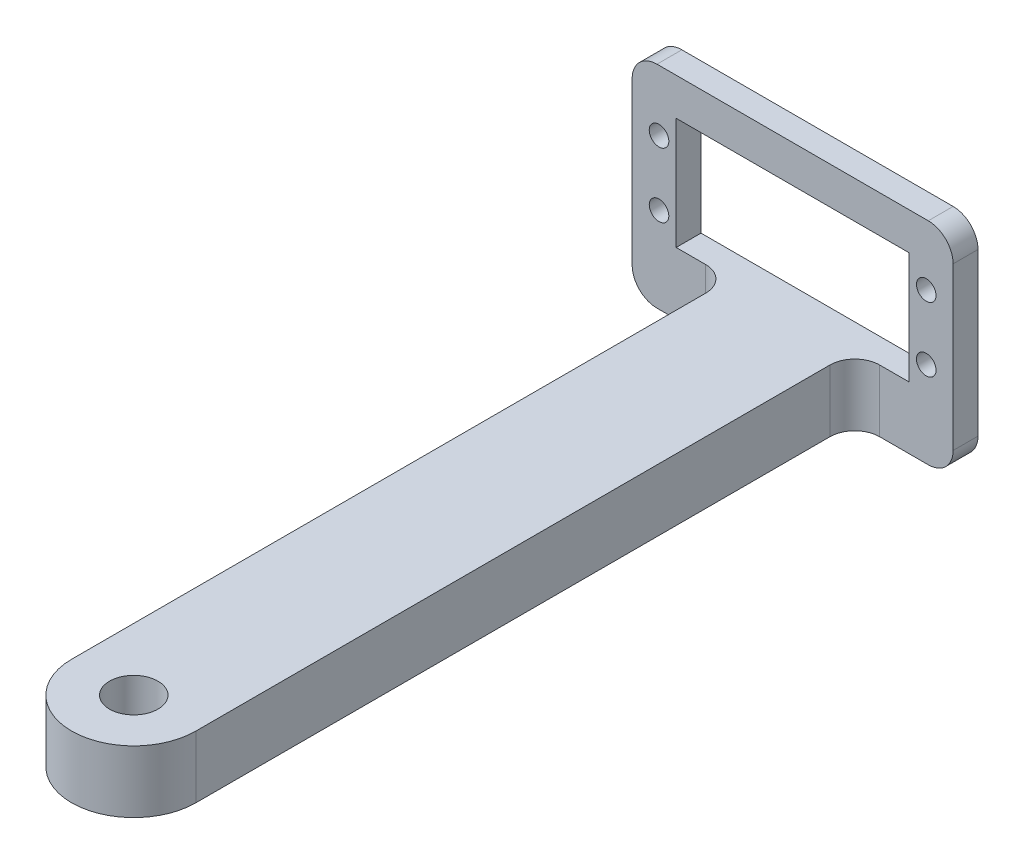
ISO-10303-21;
HEADER;
FILE_DESCRIPTION(('STEP AP214'),'2;1');
FILE_NAME('part.step','',(''),(''),'','','');
FILE_SCHEMA(('AUTOMOTIVE_DESIGN { 1 0 10303 214 1 1 1 1 }'));
ENDSEC;
DATA;
#1=APPLICATION_CONTEXT('core data for automotive mechanical design processes');
#2=APPLICATION_PROTOCOL_DEFINITION('international standard','automotive_design',2000,#1);
#3=PRODUCT_CONTEXT('',#1,'mechanical');
#4=PRODUCT('Part','Part','',(#3));
#5=PRODUCT_RELATED_PRODUCT_CATEGORY('part','',(#4));
#6=PRODUCT_DEFINITION_FORMATION('','',#4);
#7=PRODUCT_DEFINITION_CONTEXT('part definition',#1,'design');
#8=PRODUCT_DEFINITION('design','',#6,#7);
#9=PRODUCT_DEFINITION_SHAPE('','',#8);
#10=(LENGTH_UNIT() NAMED_UNIT(*) SI_UNIT(.MILLI.,.METRE.));
#11=(NAMED_UNIT(*) PLANE_ANGLE_UNIT() SI_UNIT($,.RADIAN.));
#12=(NAMED_UNIT(*) SI_UNIT($,.STERADIAN.) SOLID_ANGLE_UNIT());
#13=UNCERTAINTY_MEASURE_WITH_UNIT(LENGTH_MEASURE(1.E-05),#10,'distance_accuracy_value','');
#14=(GEOMETRIC_REPRESENTATION_CONTEXT(3) GLOBAL_UNCERTAINTY_ASSIGNED_CONTEXT((#13)) GLOBAL_UNIT_ASSIGNED_CONTEXT((#10,
#11,#12)) REPRESENTATION_CONTEXT('',''));
#15=CARTESIAN_POINT('',(0.,0.,0.));
#16=DIRECTION('',(0.,0.,1.));
#17=DIRECTION('',(1.,0.,0.));
#18=AXIS2_PLACEMENT_3D('',#15,#16,#17);
#19=CARTESIAN_POINT('',(-6.35,3.175,38.1));
#20=DIRECTION('',(1.,0.,0.));
#21=DIRECTION('',(0.,0.,-1.));
#22=AXIS2_PLACEMENT_3D('',#19,#20,#21);
#23=PLANE('',#22);
#24=DIRECTION('',(0.,0.,-1.));
#25=VECTOR('',#24,1.);
#26=CARTESIAN_POINT('',(-6.35,3.175,38.1));
#27=LINE('',#26,#25);
#28=CARTESIAN_POINT('',(-6.35,3.175,31.75));
#29=VERTEX_POINT('',#28);
#30=CARTESIAN_POINT('',(-6.35,3.175,-33.02));
#31=VERTEX_POINT('',#30);
#32=EDGE_CURVE('E241',#29,#31,#27,.T.);
#33=ORIENTED_EDGE('',*,*,#32,.T.);
#34=DIRECTION('',(0.,1.,0.));
#35=VECTOR('',#34,1.);
#36=CARTESIAN_POINT('',(-6.35,-3.175,-33.02));
#37=LINE('',#36,#35);
#38=CARTESIAN_POINT('',(-6.35,-3.175,-33.02));
#39=VERTEX_POINT('',#38);
#40=EDGE_CURVE('E303',#31,#39,#37,.F.);
#41=ORIENTED_EDGE('',*,*,#40,.T.);
#42=DIRECTION('',(0.,0.,-1.));
#43=VECTOR('',#42,1.);
#44=CARTESIAN_POINT('',(-6.35,-3.175,38.1));
#45=LINE('',#44,#43);
#46=CARTESIAN_POINT('',(-6.35,-3.175,31.75));
#47=VERTEX_POINT('',#46);
#48=EDGE_CURVE('E247',#47,#39,#45,.T.);
#49=ORIENTED_EDGE('',*,*,#48,.F.);
#50=DIRECTION('',(0.,1.,0.));
#51=VECTOR('',#50,1.);
#52=CARTESIAN_POINT('',(-6.35,-3.175,31.75));
#53=LINE('',#52,#51);
#54=EDGE_CURVE('E250',#47,#29,#53,.T.);
#55=ORIENTED_EDGE('',*,*,#54,.T.);
#56=EDGE_LOOP('',(#33,#41,#49,#55));
#57=FACE_BOUND('',#56,.T.);
#58=ADVANCED_FACE('F35',(#57),#23,.F.);
#59=CARTESIAN_POINT('',(6.35,3.175,38.1));
#60=DIRECTION('',(-1.,0.,0.));
#61=DIRECTION('',(0.,0.,1.));
#62=AXIS2_PLACEMENT_3D('',#59,#60,#61);
#63=PLANE('',#62);
#64=DIRECTION('',(0.,0.,-1.));
#65=VECTOR('',#64,1.);
#66=CARTESIAN_POINT('',(6.35,-3.175,38.1));
#67=LINE('',#66,#65);
#68=CARTESIAN_POINT('',(6.35,-3.175,31.75));
#69=VERTEX_POINT('',#68);
#70=CARTESIAN_POINT('',(6.35,-3.175,-33.02));
#71=VERTEX_POINT('',#70);
#72=EDGE_CURVE('E245',#69,#71,#67,.T.);
#73=ORIENTED_EDGE('',*,*,#72,.T.);
#74=DIRECTION('',(0.,-1.,0.));
#75=VECTOR('',#74,1.);
#76=CARTESIAN_POINT('',(6.35,3.175,-33.02));
#77=LINE('',#76,#75);
#78=CARTESIAN_POINT('',(6.35,3.175,-33.02));
#79=VERTEX_POINT('',#78);
#80=EDGE_CURVE('E57',#71,#79,#77,.F.);
#81=ORIENTED_EDGE('',*,*,#80,.T.);
#82=DIRECTION('',(0.,0.,-1.));
#83=VECTOR('',#82,1.);
#84=CARTESIAN_POINT('',(6.35,3.175,38.1));
#85=LINE('',#84,#83);
#86=CARTESIAN_POINT('',(6.35,3.175,31.75));
#87=VERTEX_POINT('',#86);
#88=EDGE_CURVE('E243',#87,#79,#85,.T.);
#89=ORIENTED_EDGE('',*,*,#88,.F.);
#90=DIRECTION('',(0.,1.,0.));
#91=VECTOR('',#90,1.);
#92=CARTESIAN_POINT('',(6.35,-3.175,31.75));
#93=LINE('',#92,#91);
#94=EDGE_CURVE('E253',#87,#69,#93,.F.);
#95=ORIENTED_EDGE('',*,*,#94,.T.);
#96=EDGE_LOOP('',(#73,#81,#89,#95));
#97=FACE_BOUND('',#96,.T.);
#98=ADVANCED_FACE('F320',(#97),#63,.F.);
#99=CARTESIAN_POINT('',(0.,-3.175,31.75));
#100=DIRECTION('',(0.,-1.,0.));
#101=DIRECTION('',(0.,0.,-1.));
#102=AXIS2_PLACEMENT_3D('',#99,#100,#101);
#103=CYLINDRICAL_SURFACE('',#102,6.35);
#104=ORIENTED_EDGE('',*,*,#54,.F.);
#105=CARTESIAN_POINT('',(0.,-3.175,31.75));
#106=DIRECTION('',(0.,1.,0.));
#107=DIRECTION('',(-1.,0.,0.));
#108=AXIS2_PLACEMENT_3D('',#105,#106,#107);
#109=CIRCLE('',#108,6.35);
#110=EDGE_CURVE('E256',#69,#47,#109,.F.);
#111=ORIENTED_EDGE('',*,*,#110,.F.);
#112=ORIENTED_EDGE('',*,*,#94,.F.);
#113=CARTESIAN_POINT('',(0.,3.175,31.75));
#114=DIRECTION('',(0.,-1.,0.));
#115=DIRECTION('',(0.,0.,-1.));
#116=AXIS2_PLACEMENT_3D('',#113,#114,#115);
#117=CIRCLE('',#116,6.35);
#118=EDGE_CURVE('E258',#29,#87,#117,.F.);
#119=ORIENTED_EDGE('',*,*,#118,.F.);
#120=EDGE_LOOP('',(#104,#111,#112,#119));
#121=FACE_BOUND('',#120,.T.);
#122=ADVANCED_FACE('F324',(#121),#103,.T.);
#123=CARTESIAN_POINT('',(-6.35,-3.175,38.1));
#124=DIRECTION('',(0.,1.,0.));
#125=DIRECTION('',(-1.,0.,0.));
#126=AXIS2_PLACEMENT_3D('',#123,#124,#125);
#127=PLANE('',#126);
#128=DIRECTION('',(-1.,0.,0.));
#129=VECTOR('',#128,1.);
#130=CARTESIAN_POINT('',(16.3957,-3.175,-35.56));
#131=LINE('',#130,#129);
#132=CARTESIAN_POINT('',(-8.89,-3.175,-35.56));
#133=VERTEX_POINT('',#132);
#134=CARTESIAN_POINT('',(-13.8557,-3.175,-35.56));
#135=VERTEX_POINT('',#134);
#136=EDGE_CURVE('E212',#133,#135,#131,.T.);
#137=ORIENTED_EDGE('',*,*,#136,.T.);
#138=DIRECTION('',(0.,0.,-1.));
#139=VECTOR('',#138,1.);
#140=CARTESIAN_POINT('',(-13.8557,-3.175,-38.1));
#141=LINE('',#140,#139);
#142=CARTESIAN_POINT('',(-13.8557,-3.175,-38.1));
#143=VERTEX_POINT('',#142);
#144=EDGE_CURVE('E262',#135,#143,#141,.T.);
#145=ORIENTED_EDGE('',*,*,#144,.T.);
#146=DIRECTION('',(1.,0.,0.));
#147=VECTOR('',#146,1.);
#148=CARTESIAN_POINT('',(-6.35,-3.175,-38.1));
#149=LINE('',#148,#147);
#150=CARTESIAN_POINT('',(13.8557,-3.175,-38.1));
#151=VERTEX_POINT('',#150);
#152=EDGE_CURVE('E236',#143,#151,#149,.T.);
#153=ORIENTED_EDGE('',*,*,#152,.T.);
#154=DIRECTION('',(0.,0.,-1.));
#155=VECTOR('',#154,1.);
#156=CARTESIAN_POINT('',(13.8557,-3.175,-35.56));
#157=LINE('',#156,#155);
#158=CARTESIAN_POINT('',(13.8557,-3.175,-35.56));
#159=VERTEX_POINT('',#158);
#160=EDGE_CURVE('E260',#151,#159,#157,.F.);
#161=ORIENTED_EDGE('',*,*,#160,.T.);
#162=CARTESIAN_POINT('',(8.89,-3.175,-35.56));
#163=VERTEX_POINT('',#162);
#164=EDGE_CURVE('E216',#159,#163,#131,.T.);
#165=ORIENTED_EDGE('',*,*,#164,.T.);
#166=CARTESIAN_POINT('',(8.89,-3.175,-33.02));
#167=DIRECTION('',(0.,1.,0.));
#168=DIRECTION('',(-1.,0.,0.));
#169=AXIS2_PLACEMENT_3D('',#166,#167,#168);
#170=CIRCLE('',#169,2.54);
#171=EDGE_CURVE('E305',#163,#71,#170,.T.);
#172=ORIENTED_EDGE('',*,*,#171,.T.);
#173=ORIENTED_EDGE('',*,*,#72,.F.);
#174=ORIENTED_EDGE('',*,*,#110,.T.);
#175=ORIENTED_EDGE('',*,*,#48,.T.);
#176=CARTESIAN_POINT('',(-8.89,-3.175,-33.02));
#177=DIRECTION('',(0.,1.,0.));
#178=DIRECTION('',(-1.,0.,0.));
#179=AXIS2_PLACEMENT_3D('',#176,#177,#178);
#180=CIRCLE('',#179,2.54);
#181=EDGE_CURVE('E11',#39,#133,#180,.T.);
#182=ORIENTED_EDGE('',*,*,#181,.T.);
#183=EDGE_LOOP('',(#137,#145,#153,#161,#165,#172,#173,#174,#175,#182));
#184=FACE_BOUND('',#183,.T.);
#185=CARTESIAN_POINT('',(0.,-3.175,31.75));
#186=DIRECTION('',(0.,1.,0.));
#187=DIRECTION('',(-1.,0.,0.));
#188=AXIS2_PLACEMENT_3D('',#185,#186,#187);
#189=CIRCLE('',#188,2.4765);
#190=CARTESIAN_POINT('',(-2.4765,-3.175,31.75));
#191=VERTEX_POINT('',#190);
#192=EDGE_CURVE('E233',#191,#191,#189,.F.);
#193=ORIENTED_EDGE('',*,*,#192,.F.);
#194=EDGE_LOOP('',(#193));
#195=FACE_BOUND('',#194,.T.);
#196=ADVANCED_FACE('F318',(#184,#195),#127,.F.);
#197=CARTESIAN_POINT('',(-6.35,3.175,38.1));
#198=DIRECTION('',(0.,-1.,0.));
#199=DIRECTION('',(0.,0.,-1.));
#200=AXIS2_PLACEMENT_3D('',#197,#198,#199);
#201=PLANE('',#200);
#202=DIRECTION('',(-1.,0.,0.));
#203=VECTOR('',#202,1.);
#204=CARTESIAN_POINT('',(-6.35,3.175,-38.1));
#205=LINE('',#204,#203);
#206=CARTESIAN_POINT('',(11.8999,3.175,-38.1));
#207=VERTEX_POINT('',#206);
#208=CARTESIAN_POINT('',(-11.8999,3.175,-38.1));
#209=VERTEX_POINT('',#208);
#210=EDGE_CURVE('E239',#207,#209,#205,.T.);
#211=ORIENTED_EDGE('',*,*,#210,.T.);
#212=DIRECTION('',(0.,0.,-1.));
#213=VECTOR('',#212,1.);
#214=CARTESIAN_POINT('',(-11.8999,3.175,-35.56));
#215=LINE('',#214,#213);
#216=CARTESIAN_POINT('',(-11.8999,3.175,-35.56));
#217=VERTEX_POINT('',#216);
#218=EDGE_CURVE('E205',#217,#209,#215,.T.);
#219=ORIENTED_EDGE('',*,*,#218,.F.);
#220=DIRECTION('',(-1.,0.,0.));
#221=VECTOR('',#220,1.);
#222=CARTESIAN_POINT('',(-11.8999,3.175,-35.56));
#223=LINE('',#222,#221);
#224=CARTESIAN_POINT('',(-8.89,3.175,-35.56));
#225=VERTEX_POINT('',#224);
#226=EDGE_CURVE('E182',#225,#217,#223,.T.);
#227=ORIENTED_EDGE('',*,*,#226,.F.);
#228=CARTESIAN_POINT('',(-8.89,3.175,-33.02));
#229=DIRECTION('',(0.,-1.,0.));
#230=DIRECTION('',(0.,0.,-1.));
#231=AXIS2_PLACEMENT_3D('',#228,#229,#230);
#232=CIRCLE('',#231,2.54);
#233=EDGE_CURVE('E43',#225,#31,#232,.T.);
#234=ORIENTED_EDGE('',*,*,#233,.T.);
#235=ORIENTED_EDGE('',*,*,#32,.F.);
#236=ORIENTED_EDGE('',*,*,#118,.T.);
#237=ORIENTED_EDGE('',*,*,#88,.T.);
#238=CARTESIAN_POINT('',(8.89,3.175,-33.02));
#239=DIRECTION('',(0.,-1.,0.));
#240=DIRECTION('',(0.,0.,-1.));
#241=AXIS2_PLACEMENT_3D('',#238,#239,#240);
#242=CIRCLE('',#241,2.54);
#243=CARTESIAN_POINT('',(8.89,3.175,-35.56));
#244=VERTEX_POINT('',#243);
#245=EDGE_CURVE('E307',#79,#244,#242,.T.);
#246=ORIENTED_EDGE('',*,*,#245,.T.);
#247=CARTESIAN_POINT('',(11.8999,3.175,-35.56));
#248=VERTEX_POINT('',#247);
#249=EDGE_CURVE('E196',#248,#244,#223,.T.);
#250=ORIENTED_EDGE('',*,*,#249,.F.);
#251=DIRECTION('',(0.,0.,-1.));
#252=VECTOR('',#251,1.);
#253=CARTESIAN_POINT('',(11.8999,3.175,-35.56));
#254=LINE('',#253,#252);
#255=EDGE_CURVE('E172',#248,#207,#254,.T.);
#256=ORIENTED_EDGE('',*,*,#255,.T.);
#257=EDGE_LOOP('',(#211,#219,#227,#234,#235,#236,#237,#246,#250,#256));
#258=FACE_BOUND('',#257,.T.);
#259=CARTESIAN_POINT('',(0.,3.175,31.75));
#260=DIRECTION('',(0.,1.,0.));
#261=DIRECTION('',(0.,0.,1.));
#262=AXIS2_PLACEMENT_3D('',#259,#260,#261);
#263=CIRCLE('',#262,2.4765);
#264=CARTESIAN_POINT('',(0.,3.175,34.2265));
#265=VERTEX_POINT('',#264);
#266=EDGE_CURVE('E223',#265,#265,#263,.T.);
#267=ORIENTED_EDGE('',*,*,#266,.F.);
#268=EDGE_LOOP('',(#267));
#269=FACE_BOUND('',#268,.T.);
#270=ADVANCED_FACE('F309',(#258,#269),#201,.F.);
#271=CARTESIAN_POINT('',(0.,0.,-38.1));
#272=DIRECTION('',(0.,0.,1.));
#273=DIRECTION('',(1.,0.,0.));
#274=AXIS2_PLACEMENT_3D('',#271,#272,#273);
#275=PLANE('',#274);
#276=ORIENTED_EDGE('',*,*,#152,.F.);
#277=CARTESIAN_POINT('',(-13.8557,-0.635000000000002,-38.1));
#278=DIRECTION('',(0.,0.,1.));
#279=DIRECTION('',(1.,0.,0.));
#280=AXIS2_PLACEMENT_3D('',#277,#278,#279);
#281=CIRCLE('',#280,2.54);
#282=CARTESIAN_POINT('',(-16.3957,-0.635,-38.1));
#283=VERTEX_POINT('',#282);
#284=EDGE_CURVE('E271',#143,#283,#281,.F.);
#285=ORIENTED_EDGE('',*,*,#284,.T.);
#286=DIRECTION('',(0.,1.,0.));
#287=VECTOR('',#286,1.);
#288=CARTESIAN_POINT('',(-16.3957,18.415,-38.1));
#289=LINE('',#288,#287);
#290=CARTESIAN_POINT('',(-16.3957,15.875,-38.1));
#291=VERTEX_POINT('',#290);
#292=EDGE_CURVE('E226',#283,#291,#289,.T.);
#293=ORIENTED_EDGE('',*,*,#292,.T.);
#294=CARTESIAN_POINT('',(-13.8557,15.875,-38.1));
#295=DIRECTION('',(0.,0.,1.));
#296=DIRECTION('',(1.,0.,0.));
#297=AXIS2_PLACEMENT_3D('',#294,#295,#296);
#298=CIRCLE('',#297,2.54);
#299=CARTESIAN_POINT('',(-13.8557,18.415,-38.1));
#300=VERTEX_POINT('',#299);
#301=EDGE_CURVE('E269',#291,#300,#298,.F.);
#302=ORIENTED_EDGE('',*,*,#301,.T.);
#303=DIRECTION('',(1.,0.,0.));
#304=VECTOR('',#303,1.);
#305=CARTESIAN_POINT('',(16.3957,18.415,-38.1));
#306=LINE('',#305,#304);
#307=CARTESIAN_POINT('',(13.8557,18.415,-38.1));
#308=VERTEX_POINT('',#307);
#309=EDGE_CURVE('E213',#300,#308,#306,.T.);
#310=ORIENTED_EDGE('',*,*,#309,.T.);
#311=CARTESIAN_POINT('',(13.8557,15.875,-38.1));
#312=DIRECTION('',(0.,0.,1.));
#313=DIRECTION('',(1.,0.,0.));
#314=AXIS2_PLACEMENT_3D('',#311,#312,#313);
#315=CIRCLE('',#314,2.54);
#316=CARTESIAN_POINT('',(16.3957,15.875,-38.1));
#317=VERTEX_POINT('',#316);
#318=EDGE_CURVE('E267',#308,#317,#315,.F.);
#319=ORIENTED_EDGE('',*,*,#318,.T.);
#320=DIRECTION('',(0.,-1.,0.));
#321=VECTOR('',#320,1.);
#322=CARTESIAN_POINT('',(16.3957,18.415,-38.1));
#323=LINE('',#322,#321);
#324=CARTESIAN_POINT('',(16.3957,-0.635,-38.1));
#325=VERTEX_POINT('',#324);
#326=EDGE_CURVE('E204',#317,#325,#323,.T.);
#327=ORIENTED_EDGE('',*,*,#326,.T.);
#328=CARTESIAN_POINT('',(13.8557,-0.635,-38.1));
#329=DIRECTION('',(0.,0.,1.));
#330=DIRECTION('',(1.,0.,0.));
#331=AXIS2_PLACEMENT_3D('',#328,#329,#330);
#332=CIRCLE('',#331,2.54);
#333=EDGE_CURVE('E265',#325,#151,#332,.F.);
#334=ORIENTED_EDGE('',*,*,#333,.T.);
#335=EDGE_LOOP('',(#276,#285,#293,#302,#310,#319,#327,#334));
#336=FACE_BOUND('',#335,.T.);
#337=DIRECTION('',(0.,1.,0.));
#338=VECTOR('',#337,1.);
#339=CARTESIAN_POINT('',(-11.8999,3.175,-38.1));
#340=LINE('',#339,#338);
#341=CARTESIAN_POINT('',(-11.8999,14.605,-38.1));
#342=VERTEX_POINT('',#341);
#343=EDGE_CURVE('E187',#209,#342,#340,.T.);
#344=ORIENTED_EDGE('',*,*,#343,.F.);
#345=ORIENTED_EDGE('',*,*,#210,.F.);
#346=DIRECTION('',(0.,-1.,0.));
#347=VECTOR('',#346,1.);
#348=CARTESIAN_POINT('',(11.8999,3.175,-38.1));
#349=LINE('',#348,#347);
#350=CARTESIAN_POINT('',(11.8999,14.605,-38.1));
#351=VERTEX_POINT('',#350);
#352=EDGE_CURVE('E190',#351,#207,#349,.T.);
#353=ORIENTED_EDGE('',*,*,#352,.F.);
#354=DIRECTION('',(1.,0.,0.));
#355=VECTOR('',#354,1.);
#356=CARTESIAN_POINT('',(-11.8999,14.605,-38.1));
#357=LINE('',#356,#355);
#358=EDGE_CURVE('E168',#342,#351,#357,.T.);
#359=ORIENTED_EDGE('',*,*,#358,.F.);
#360=EDGE_LOOP('',(#344,#345,#353,#359));
#361=FACE_BOUND('',#360,.T.);
#362=CARTESIAN_POINT('',(-13.65,5.588,-38.1));
#363=DIRECTION('',(0.,0.,-1.));
#364=DIRECTION('',(-1.,0.,0.));
#365=AXIS2_PLACEMENT_3D('',#362,#363,#364);
#366=CIRCLE('',#365,0.999997999999998);
#367=CARTESIAN_POINT('',(-14.649998,5.588,-38.1));
#368=VERTEX_POINT('',#367);
#369=EDGE_CURVE('E193',#368,#368,#366,.T.);
#370=ORIENTED_EDGE('',*,*,#369,.F.);
#371=EDGE_LOOP('',(#370));
#372=FACE_BOUND('',#371,.T.);
#373=CARTESIAN_POINT('',(-13.65,12.192,-38.1));
#374=DIRECTION('',(0.,0.,-1.));
#375=DIRECTION('',(-1.,0.,0.));
#376=AXIS2_PLACEMENT_3D('',#373,#374,#375);
#377=CIRCLE('',#376,0.999998);
#378=CARTESIAN_POINT('',(-14.649998,12.192,-38.1));
#379=VERTEX_POINT('',#378);
#380=EDGE_CURVE('E349',#379,#379,#377,.T.);
#381=ORIENTED_EDGE('',*,*,#380,.F.);
#382=EDGE_LOOP('',(#381));
#383=FACE_BOUND('',#382,.T.);
#384=CARTESIAN_POINT('',(13.65,5.588,-38.1));
#385=DIRECTION('',(0.,0.,-1.));
#386=DIRECTION('',(-1.,0.,0.));
#387=AXIS2_PLACEMENT_3D('',#384,#385,#386);
#388=CIRCLE('',#387,0.999997999999998);
#389=CARTESIAN_POINT('',(12.650002,5.588,-38.1));
#390=VERTEX_POINT('',#389);
#391=EDGE_CURVE('E353',#390,#390,#388,.T.);
#392=ORIENTED_EDGE('',*,*,#391,.F.);
#393=EDGE_LOOP('',(#392));
#394=FACE_BOUND('',#393,.T.);
#395=CARTESIAN_POINT('',(13.65,12.192,-38.1));
#396=DIRECTION('',(0.,0.,-1.));
#397=DIRECTION('',(-1.,0.,0.));
#398=AXIS2_PLACEMENT_3D('',#395,#396,#397);
#399=CIRCLE('',#398,0.999998);
#400=CARTESIAN_POINT('',(12.650002,12.192,-38.1));
#401=VERTEX_POINT('',#400);
#402=EDGE_CURVE('E356',#401,#401,#399,.T.);
#403=ORIENTED_EDGE('',*,*,#402,.F.);
#404=EDGE_LOOP('',(#403));
#405=FACE_BOUND('',#404,.T.);
#406=ADVANCED_FACE('F337',(#336,#361,#372,#383,#394,#405),#275,.F.);
#407=CARTESIAN_POINT('',(0.,-3.176,31.75));
#408=DIRECTION('',(0.,1.,0.));
#409=DIRECTION('',(0.,0.,1.));
#410=AXIS2_PLACEMENT_3D('',#407,#408,#409);
#411=CYLINDRICAL_SURFACE('',#410,2.4765);
#412=ORIENTED_EDGE('',*,*,#266,.T.);
#413=EDGE_LOOP('',(#412));
#414=FACE_BOUND('',#413,.T.);
#415=ORIENTED_EDGE('',*,*,#192,.T.);
#416=EDGE_LOOP('',(#415));
#417=FACE_BOUND('',#416,.T.);
#418=ADVANCED_FACE('F340',(#414,#417),#411,.F.);
#419=CARTESIAN_POINT('',(0.,0.,-35.56));
#420=DIRECTION('',(0.,0.,-1.));
#421=DIRECTION('',(-1.,0.,0.));
#422=AXIS2_PLACEMENT_3D('',#419,#420,#421);
#423=PLANE('',#422);
#424=CARTESIAN_POINT('',(13.65,12.192,-35.56));
#425=DIRECTION('',(0.,0.,-1.));
#426=DIRECTION('',(-1.,0.,0.));
#427=AXIS2_PLACEMENT_3D('',#424,#425,#426);
#428=CIRCLE('',#427,0.999998);
#429=CARTESIAN_POINT('',(12.650002,12.192,-35.56));
#430=VERTEX_POINT('',#429);
#431=EDGE_CURVE('E358',#430,#430,#428,.T.);
#432=ORIENTED_EDGE('',*,*,#431,.T.);
#433=EDGE_LOOP('',(#432));
#434=FACE_BOUND('',#433,.T.);
#435=CARTESIAN_POINT('',(13.65,5.588,-35.56));
#436=DIRECTION('',(0.,0.,-1.));
#437=DIRECTION('',(-1.,0.,0.));
#438=AXIS2_PLACEMENT_3D('',#435,#436,#437);
#439=CIRCLE('',#438,0.999997999999998);
#440=CARTESIAN_POINT('',(12.650002,5.588,-35.56));
#441=VERTEX_POINT('',#440);
#442=EDGE_CURVE('E363',#441,#441,#439,.T.);
#443=ORIENTED_EDGE('',*,*,#442,.T.);
#444=EDGE_LOOP('',(#443));
#445=FACE_BOUND('',#444,.T.);
#446=CARTESIAN_POINT('',(-13.65,12.192,-35.56));
#447=DIRECTION('',(0.,0.,-1.));
#448=DIRECTION('',(-1.,0.,0.));
#449=AXIS2_PLACEMENT_3D('',#446,#447,#448);
#450=CIRCLE('',#449,0.999998);
#451=CARTESIAN_POINT('',(-14.649998,12.192,-35.56));
#452=VERTEX_POINT('',#451);
#453=EDGE_CURVE('E367',#452,#452,#450,.T.);
#454=ORIENTED_EDGE('',*,*,#453,.T.);
#455=EDGE_LOOP('',(#454));
#456=FACE_BOUND('',#455,.T.);
#457=CARTESIAN_POINT('',(-13.65,5.588,-35.56));
#458=DIRECTION('',(0.,0.,-1.));
#459=DIRECTION('',(-1.,0.,0.));
#460=AXIS2_PLACEMENT_3D('',#457,#458,#459);
#461=CIRCLE('',#460,0.999997999999998);
#462=CARTESIAN_POINT('',(-14.649998,5.588,-35.56));
#463=VERTEX_POINT('',#462);
#464=EDGE_CURVE('E200',#463,#463,#461,.T.);
#465=ORIENTED_EDGE('',*,*,#464,.T.);
#466=EDGE_LOOP('',(#465));
#467=FACE_BOUND('',#466,.T.);
#468=DIRECTION('',(0.,1.,0.));
#469=VECTOR('',#468,1.);
#470=CARTESIAN_POINT('',(-16.3957,18.415,-35.56));
#471=LINE('',#470,#469);
#472=CARTESIAN_POINT('',(-16.3957,-0.635,-35.56));
#473=VERTEX_POINT('',#472);
#474=CARTESIAN_POINT('',(-16.3957,15.875,-35.56));
#475=VERTEX_POINT('',#474);
#476=EDGE_CURVE('E217',#473,#475,#471,.T.);
#477=ORIENTED_EDGE('',*,*,#476,.F.);
#478=CARTESIAN_POINT('',(-13.8557,-0.635000000000002,-35.56));
#479=DIRECTION('',(0.,0.,-1.));
#480=DIRECTION('',(-1.,0.,0.));
#481=AXIS2_PLACEMENT_3D('',#478,#479,#480);
#482=CIRCLE('',#481,2.54);
#483=EDGE_CURVE('E290',#473,#135,#482,.F.);
#484=ORIENTED_EDGE('',*,*,#483,.T.);
#485=ORIENTED_EDGE('',*,*,#136,.F.);
#486=DIRECTION('',(0.,1.,0.));
#487=VECTOR('',#486,1.);
#488=CARTESIAN_POINT('',(-8.89,3.175,-35.56));
#489=LINE('',#488,#487);
#490=EDGE_CURVE('E278',#133,#225,#489,.T.);
#491=ORIENTED_EDGE('',*,*,#490,.T.);
#492=ORIENTED_EDGE('',*,*,#226,.T.);
#493=DIRECTION('',(0.,1.,0.));
#494=VECTOR('',#493,1.);
#495=CARTESIAN_POINT('',(-11.8999,3.175,-35.56));
#496=LINE('',#495,#494);
#497=CARTESIAN_POINT('',(-11.8999,14.605,-35.56));
#498=VERTEX_POINT('',#497);
#499=EDGE_CURVE('E173',#217,#498,#496,.T.);
#500=ORIENTED_EDGE('',*,*,#499,.T.);
#501=DIRECTION('',(1.,0.,0.));
#502=VECTOR('',#501,1.);
#503=CARTESIAN_POINT('',(-11.8999,14.605,-35.56));
#504=LINE('',#503,#502);
#505=CARTESIAN_POINT('',(11.8999,14.605,-35.56));
#506=VERTEX_POINT('',#505);
#507=EDGE_CURVE('E165',#498,#506,#504,.T.);
#508=ORIENTED_EDGE('',*,*,#507,.T.);
#509=DIRECTION('',(0.,-1.,0.));
#510=VECTOR('',#509,1.);
#511=CARTESIAN_POINT('',(11.8999,3.175,-35.56));
#512=LINE('',#511,#510);
#513=EDGE_CURVE('E177',#506,#248,#512,.T.);
#514=ORIENTED_EDGE('',*,*,#513,.T.);
#515=ORIENTED_EDGE('',*,*,#249,.T.);
#516=DIRECTION('',(0.,-1.,0.));
#517=VECTOR('',#516,1.);
#518=CARTESIAN_POINT('',(8.89,-3.175,-35.56));
#519=LINE('',#518,#517);
#520=EDGE_CURVE('E281',#244,#163,#519,.T.);
#521=ORIENTED_EDGE('',*,*,#520,.T.);
#522=ORIENTED_EDGE('',*,*,#164,.F.);
#523=CARTESIAN_POINT('',(13.8557,-0.635,-35.56));
#524=DIRECTION('',(0.,0.,-1.));
#525=DIRECTION('',(-1.,0.,0.));
#526=AXIS2_PLACEMENT_3D('',#523,#524,#525);
#527=CIRCLE('',#526,2.54);
#528=CARTESIAN_POINT('',(16.3957,-0.635,-35.56));
#529=VERTEX_POINT('',#528);
#530=EDGE_CURVE('E284',#159,#529,#527,.F.);
#531=ORIENTED_EDGE('',*,*,#530,.T.);
#532=DIRECTION('',(0.,-1.,0.));
#533=VECTOR('',#532,1.);
#534=CARTESIAN_POINT('',(16.3957,18.415,-35.56));
#535=LINE('',#534,#533);
#536=CARTESIAN_POINT('',(16.3957,15.875,-35.56));
#537=VERTEX_POINT('',#536);
#538=EDGE_CURVE('E209',#537,#529,#535,.T.);
#539=ORIENTED_EDGE('',*,*,#538,.F.);
#540=CARTESIAN_POINT('',(13.8557,15.875,-35.56));
#541=DIRECTION('',(0.,0.,-1.));
#542=DIRECTION('',(-1.,0.,0.));
#543=AXIS2_PLACEMENT_3D('',#540,#541,#542);
#544=CIRCLE('',#543,2.54);
#545=CARTESIAN_POINT('',(13.8557,18.415,-35.56));
#546=VERTEX_POINT('',#545);
#547=EDGE_CURVE('E286',#537,#546,#544,.F.);
#548=ORIENTED_EDGE('',*,*,#547,.T.);
#549=DIRECTION('',(1.,0.,0.));
#550=VECTOR('',#549,1.);
#551=CARTESIAN_POINT('',(16.3957,18.415,-35.56));
#552=LINE('',#551,#550);
#553=CARTESIAN_POINT('',(-13.8557,18.415,-35.56));
#554=VERTEX_POINT('',#553);
#555=EDGE_CURVE('E220',#554,#546,#552,.T.);
#556=ORIENTED_EDGE('',*,*,#555,.F.);
#557=CARTESIAN_POINT('',(-13.8557,15.875,-35.56));
#558=DIRECTION('',(0.,0.,-1.));
#559=DIRECTION('',(-1.,0.,0.));
#560=AXIS2_PLACEMENT_3D('',#557,#558,#559);
#561=CIRCLE('',#560,2.54);
#562=EDGE_CURVE('E288',#554,#475,#561,.F.);
#563=ORIENTED_EDGE('',*,*,#562,.T.);
#564=EDGE_LOOP('',(#477,#484,#485,#491,#492,#500,#508,#514,#515,#521,#522,#531,#539,#548,#556,#563));
#565=FACE_BOUND('',#564,.T.);
#566=ADVANCED_FACE('F185',(#434,#445,#456,#467,#565),#423,.F.);
#567=CARTESIAN_POINT('',(16.3957,18.415,-35.56));
#568=DIRECTION('',(1.,0.,0.));
#569=DIRECTION('',(0.,0.,-1.));
#570=AXIS2_PLACEMENT_3D('',#567,#568,#569);
#571=PLANE('',#570);
#572=ORIENTED_EDGE('',*,*,#326,.F.);
#573=DIRECTION('',(0.,0.,-1.));
#574=VECTOR('',#573,1.);
#575=CARTESIAN_POINT('',(16.3957,15.875,-35.56));
#576=LINE('',#575,#574);
#577=EDGE_CURVE('E300',#317,#537,#576,.F.);
#578=ORIENTED_EDGE('',*,*,#577,.T.);
#579=ORIENTED_EDGE('',*,*,#538,.T.);
#580=DIRECTION('',(0.,0.,-1.));
#581=VECTOR('',#580,1.);
#582=CARTESIAN_POINT('',(16.3957,-0.635,-38.1));
#583=LINE('',#582,#581);
#584=EDGE_CURVE('E297',#529,#325,#583,.T.);
#585=ORIENTED_EDGE('',*,*,#584,.T.);
#586=EDGE_LOOP('',(#572,#578,#579,#585));
#587=FACE_BOUND('',#586,.T.);
#588=ADVANCED_FACE('F475',(#587),#571,.T.);
#589=CARTESIAN_POINT('',(16.3957,18.415,-35.56));
#590=DIRECTION('',(0.,1.,0.));
#591=DIRECTION('',(0.,0.,1.));
#592=AXIS2_PLACEMENT_3D('',#589,#590,#591);
#593=PLANE('',#592);
#594=ORIENTED_EDGE('',*,*,#309,.F.);
#595=DIRECTION('',(0.,0.,-1.));
#596=VECTOR('',#595,1.);
#597=CARTESIAN_POINT('',(-13.8557,18.415,-35.56));
#598=LINE('',#597,#596);
#599=EDGE_CURVE('E295',#300,#554,#598,.F.);
#600=ORIENTED_EDGE('',*,*,#599,.T.);
#601=ORIENTED_EDGE('',*,*,#555,.T.);
#602=DIRECTION('',(0.,0.,-1.));
#603=VECTOR('',#602,1.);
#604=CARTESIAN_POINT('',(13.8557,18.415,-35.56));
#605=LINE('',#604,#603);
#606=EDGE_CURVE('E292',#546,#308,#605,.T.);
#607=ORIENTED_EDGE('',*,*,#606,.T.);
#608=EDGE_LOOP('',(#594,#600,#601,#607));
#609=FACE_BOUND('',#608,.T.);
#610=ADVANCED_FACE('F463',(#609),#593,.T.);
#611=CARTESIAN_POINT('',(-16.3957,18.415,-35.56));
#612=DIRECTION('',(-1.,0.,0.));
#613=DIRECTION('',(0.,0.,1.));
#614=AXIS2_PLACEMENT_3D('',#611,#612,#613);
#615=PLANE('',#614);
#616=ORIENTED_EDGE('',*,*,#292,.F.);
#617=DIRECTION('',(0.,0.,-1.));
#618=VECTOR('',#617,1.);
#619=CARTESIAN_POINT('',(-16.3957,-0.635000000000002,-35.56));
#620=LINE('',#619,#618);
#621=EDGE_CURVE('E276',#283,#473,#620,.F.);
#622=ORIENTED_EDGE('',*,*,#621,.T.);
#623=ORIENTED_EDGE('',*,*,#476,.T.);
#624=DIRECTION('',(0.,0.,-1.));
#625=VECTOR('',#624,1.);
#626=CARTESIAN_POINT('',(-16.3957,15.875,-35.56));
#627=LINE('',#626,#625);
#628=EDGE_CURVE('E273',#475,#291,#627,.T.);
#629=ORIENTED_EDGE('',*,*,#628,.T.);
#630=EDGE_LOOP('',(#616,#622,#623,#629));
#631=FACE_BOUND('',#630,.T.);
#632=ADVANCED_FACE('F458',(#631),#615,.T.);
#633=CARTESIAN_POINT('',(-11.8999,14.605,-35.56));
#634=DIRECTION('',(0.,1.,0.));
#635=DIRECTION('',(-1.,0.,0.));
#636=AXIS2_PLACEMENT_3D('',#633,#634,#635);
#637=PLANE('',#636);
#638=ORIENTED_EDGE('',*,*,#358,.T.);
#639=DIRECTION('',(0.,0.,-1.));
#640=VECTOR('',#639,1.);
#641=CARTESIAN_POINT('',(11.8999,14.605,-35.56));
#642=LINE('',#641,#640);
#643=EDGE_CURVE('E161',#506,#351,#642,.T.);
#644=ORIENTED_EDGE('',*,*,#643,.F.);
#645=ORIENTED_EDGE('',*,*,#507,.F.);
#646=DIRECTION('',(0.,0.,-1.));
#647=VECTOR('',#646,1.);
#648=CARTESIAN_POINT('',(-11.8999,14.605,-35.56));
#649=LINE('',#648,#647);
#650=EDGE_CURVE('E202',#498,#342,#649,.T.);
#651=ORIENTED_EDGE('',*,*,#650,.T.);
#652=EDGE_LOOP('',(#638,#644,#645,#651));
#653=FACE_BOUND('',#652,.T.);
#654=ADVANCED_FACE('F163',(#653),#637,.F.);
#655=CARTESIAN_POINT('',(-11.8999,3.175,-35.56));
#656=DIRECTION('',(-1.,0.,0.));
#657=DIRECTION('',(0.,0.,1.));
#658=AXIS2_PLACEMENT_3D('',#655,#656,#657);
#659=PLANE('',#658);
#660=ORIENTED_EDGE('',*,*,#343,.T.);
#661=ORIENTED_EDGE('',*,*,#650,.F.);
#662=ORIENTED_EDGE('',*,*,#499,.F.);
#663=ORIENTED_EDGE('',*,*,#218,.T.);
#664=EDGE_LOOP('',(#660,#661,#662,#663));
#665=FACE_BOUND('',#664,.T.);
#666=ADVANCED_FACE('F335',(#665),#659,.F.);
#667=CARTESIAN_POINT('',(11.8999,3.175,-35.56));
#668=DIRECTION('',(1.,0.,0.));
#669=DIRECTION('',(0.,0.,-1.));
#670=AXIS2_PLACEMENT_3D('',#667,#668,#669);
#671=PLANE('',#670);
#672=ORIENTED_EDGE('',*,*,#352,.T.);
#673=ORIENTED_EDGE('',*,*,#255,.F.);
#674=ORIENTED_EDGE('',*,*,#513,.F.);
#675=ORIENTED_EDGE('',*,*,#643,.T.);
#676=EDGE_LOOP('',(#672,#673,#674,#675));
#677=FACE_BOUND('',#676,.T.);
#678=ADVANCED_FACE('F178',(#677),#671,.F.);
#679=CARTESIAN_POINT('',(-13.65,5.588,-35.56));
#680=DIRECTION('',(0.,0.,-1.));
#681=DIRECTION('',(-1.,0.,0.));
#682=AXIS2_PLACEMENT_3D('',#679,#680,#681);
#683=CYLINDRICAL_SURFACE('',#682,0.999997999999998);
#684=ORIENTED_EDGE('',*,*,#464,.F.);
#685=EDGE_LOOP('',(#684));
#686=FACE_BOUND('',#685,.T.);
#687=ORIENTED_EDGE('',*,*,#369,.T.);
#688=EDGE_LOOP('',(#687));
#689=FACE_BOUND('',#688,.T.);
#690=ADVANCED_FACE('F374',(#686,#689),#683,.F.);
#691=CARTESIAN_POINT('',(-13.65,12.192,-35.56));
#692=DIRECTION('',(0.,0.,-1.));
#693=DIRECTION('',(-1.,0.,0.));
#694=AXIS2_PLACEMENT_3D('',#691,#692,#693);
#695=CYLINDRICAL_SURFACE('',#694,0.999998);
#696=ORIENTED_EDGE('',*,*,#453,.F.);
#697=EDGE_LOOP('',(#696));
#698=FACE_BOUND('',#697,.T.);
#699=ORIENTED_EDGE('',*,*,#380,.T.);
#700=EDGE_LOOP('',(#699));
#701=FACE_BOUND('',#700,.T.);
#702=ADVANCED_FACE('F376',(#698,#701),#695,.F.);
#703=CARTESIAN_POINT('',(13.65,5.588,-35.56));
#704=DIRECTION('',(0.,0.,-1.));
#705=DIRECTION('',(-1.,0.,0.));
#706=AXIS2_PLACEMENT_3D('',#703,#704,#705);
#707=CYLINDRICAL_SURFACE('',#706,0.999997999999998);
#708=ORIENTED_EDGE('',*,*,#442,.F.);
#709=EDGE_LOOP('',(#708));
#710=FACE_BOUND('',#709,.T.);
#711=ORIENTED_EDGE('',*,*,#391,.T.);
#712=EDGE_LOOP('',(#711));
#713=FACE_BOUND('',#712,.T.);
#714=ADVANCED_FACE('F383',(#710,#713),#707,.F.);
#715=CARTESIAN_POINT('',(13.65,12.192,-35.56));
#716=DIRECTION('',(0.,0.,-1.));
#717=DIRECTION('',(-1.,0.,0.));
#718=AXIS2_PLACEMENT_3D('',#715,#716,#717);
#719=CYLINDRICAL_SURFACE('',#718,0.999998);
#720=ORIENTED_EDGE('',*,*,#431,.F.);
#721=EDGE_LOOP('',(#720));
#722=FACE_BOUND('',#721,.T.);
#723=ORIENTED_EDGE('',*,*,#402,.T.);
#724=EDGE_LOOP('',(#723));
#725=FACE_BOUND('',#724,.T.);
#726=ADVANCED_FACE('F405',(#722,#725),#719,.F.);
#727=CARTESIAN_POINT('',(-13.8557,-0.635000000000002,38.1));
#728=DIRECTION('',(0.,0.,1.));
#729=DIRECTION('',(1.,0.,0.));
#730=AXIS2_PLACEMENT_3D('',#727,#728,#729);
#731=CYLINDRICAL_SURFACE('',#730,2.54);
#732=ORIENTED_EDGE('',*,*,#483,.F.);
#733=ORIENTED_EDGE('',*,*,#621,.F.);
#734=ORIENTED_EDGE('',*,*,#284,.F.);
#735=ORIENTED_EDGE('',*,*,#144,.F.);
#736=EDGE_LOOP('',(#732,#733,#734,#735));
#737=FACE_BOUND('',#736,.T.);
#738=ADVANCED_FACE('F401',(#737),#731,.T.);
#739=CARTESIAN_POINT('',(-13.8557,15.875,-35.56));
#740=DIRECTION('',(0.,0.,-1.));
#741=DIRECTION('',(-1.,0.,0.));
#742=AXIS2_PLACEMENT_3D('',#739,#740,#741);
#743=CYLINDRICAL_SURFACE('',#742,2.54);
#744=ORIENTED_EDGE('',*,*,#562,.F.);
#745=ORIENTED_EDGE('',*,*,#599,.F.);
#746=ORIENTED_EDGE('',*,*,#301,.F.);
#747=ORIENTED_EDGE('',*,*,#628,.F.);
#748=EDGE_LOOP('',(#744,#745,#746,#747));
#749=FACE_BOUND('',#748,.T.);
#750=ADVANCED_FACE('F404',(#749),#743,.T.);
#751=CARTESIAN_POINT('',(13.8557,15.875,-35.56));
#752=DIRECTION('',(0.,0.,-1.));
#753=DIRECTION('',(-1.,0.,0.));
#754=AXIS2_PLACEMENT_3D('',#751,#752,#753);
#755=CYLINDRICAL_SURFACE('',#754,2.54);
#756=ORIENTED_EDGE('',*,*,#547,.F.);
#757=ORIENTED_EDGE('',*,*,#577,.F.);
#758=ORIENTED_EDGE('',*,*,#318,.F.);
#759=ORIENTED_EDGE('',*,*,#606,.F.);
#760=EDGE_LOOP('',(#756,#757,#758,#759));
#761=FACE_BOUND('',#760,.T.);
#762=ADVANCED_FACE('F409',(#761),#755,.T.);
#763=CARTESIAN_POINT('',(13.8557,-0.635,-35.56));
#764=DIRECTION('',(0.,0.,1.));
#765=DIRECTION('',(1.,0.,0.));
#766=AXIS2_PLACEMENT_3D('',#763,#764,#765);
#767=CYLINDRICAL_SURFACE('',#766,2.54);
#768=ORIENTED_EDGE('',*,*,#530,.F.);
#769=ORIENTED_EDGE('',*,*,#160,.F.);
#770=ORIENTED_EDGE('',*,*,#333,.F.);
#771=ORIENTED_EDGE('',*,*,#584,.F.);
#772=EDGE_LOOP('',(#768,#769,#770,#771));
#773=FACE_BOUND('',#772,.T.);
#774=ADVANCED_FACE('F413',(#773),#767,.T.);
#775=CARTESIAN_POINT('',(8.89,0.,-33.02));
#776=DIRECTION('',(0.,1.,0.));
#777=DIRECTION('',(0.,0.,1.));
#778=AXIS2_PLACEMENT_3D('',#775,#776,#777);
#779=CYLINDRICAL_SURFACE('',#778,2.54);
#780=ORIENTED_EDGE('',*,*,#245,.F.);
#781=ORIENTED_EDGE('',*,*,#80,.F.);
#782=ORIENTED_EDGE('',*,*,#171,.F.);
#783=ORIENTED_EDGE('',*,*,#520,.F.);
#784=EDGE_LOOP('',(#780,#781,#782,#783));
#785=FACE_BOUND('',#784,.T.);
#786=ADVANCED_FACE('F315',(#785),#779,.F.);
#787=CARTESIAN_POINT('',(-8.89,0.,-33.02));
#788=DIRECTION('',(0.,-1.,0.));
#789=DIRECTION('',(0.,0.,-1.));
#790=AXIS2_PLACEMENT_3D('',#787,#788,#789);
#791=CYLINDRICAL_SURFACE('',#790,2.54);
#792=ORIENTED_EDGE('',*,*,#181,.F.);
#793=ORIENTED_EDGE('',*,*,#40,.F.);
#794=ORIENTED_EDGE('',*,*,#233,.F.);
#795=ORIENTED_EDGE('',*,*,#490,.F.);
#796=EDGE_LOOP('',(#792,#793,#794,#795));
#797=FACE_BOUND('',#796,.T.);
#798=ADVANCED_FACE('F37',(#797),#791,.F.);
#799=CLOSED_SHELL('',(#58,#98,#122,#196,#270,#406,#418,#566,#588,#610,#632,#654,#666,#678,#690,
#702,#714,#726,#738,#750,#762,#774,#786,#798));
#800=MANIFOLD_SOLID_BREP('B2',#799);
#801=ADVANCED_BREP_SHAPE_REPRESENTATION('',(#18,#800),#14);
#802=SHAPE_DEFINITION_REPRESENTATION(#9,#801);
ENDSEC;
END-ISO-10303-21;
